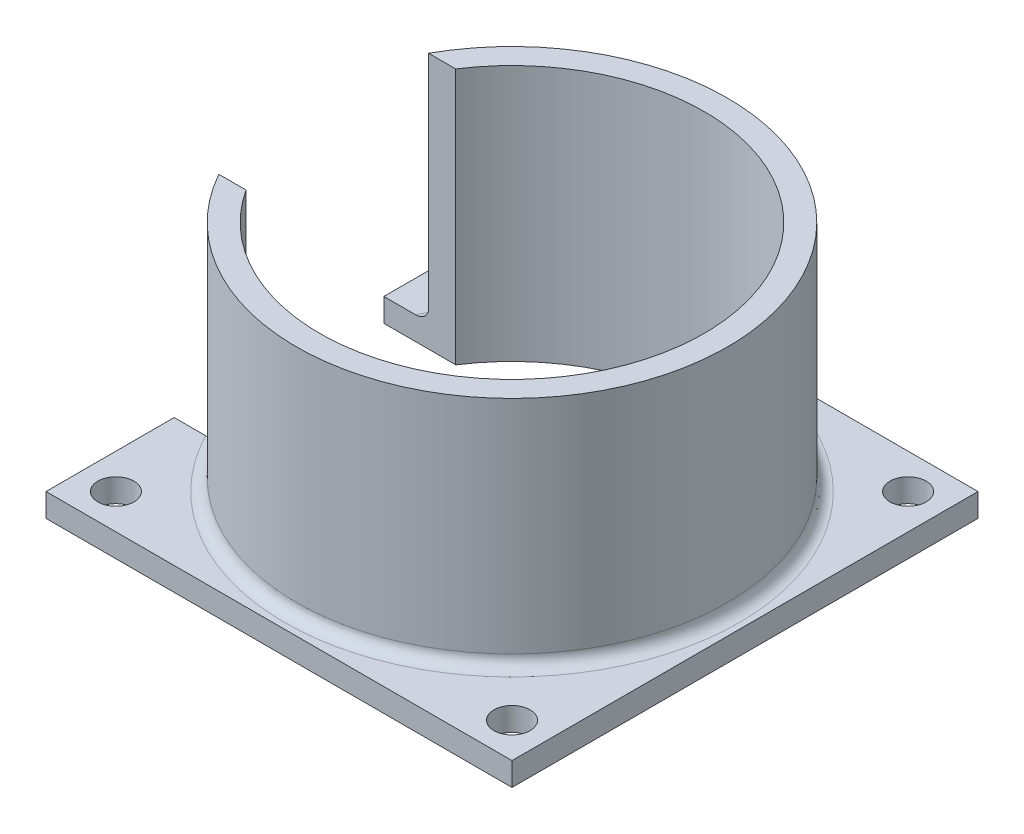
ISO-10303-21;
HEADER;
FILE_DESCRIPTION(('STEP AP214'),'2;1');
FILE_NAME('part.step','',(''),(''),'','','');
FILE_SCHEMA(('AUTOMOTIVE_DESIGN { 1 0 10303 214 1 1 1 1 }'));
ENDSEC;
DATA;
#1=APPLICATION_CONTEXT('core data for automotive mechanical design processes');
#2=APPLICATION_PROTOCOL_DEFINITION('international standard','automotive_design',2000,#1);
#3=PRODUCT_CONTEXT('',#1,'mechanical');
#4=PRODUCT('Part','Part','',(#3));
#5=PRODUCT_RELATED_PRODUCT_CATEGORY('part','',(#4));
#6=PRODUCT_DEFINITION_FORMATION('','',#4);
#7=PRODUCT_DEFINITION_CONTEXT('part definition',#1,'design');
#8=PRODUCT_DEFINITION('design','',#6,#7);
#9=PRODUCT_DEFINITION_SHAPE('','',#8);
#10=(LENGTH_UNIT() NAMED_UNIT(*) SI_UNIT(.MILLI.,.METRE.));
#11=(NAMED_UNIT(*) PLANE_ANGLE_UNIT() SI_UNIT($,.RADIAN.));
#12=(NAMED_UNIT(*) SI_UNIT($,.STERADIAN.) SOLID_ANGLE_UNIT());
#13=UNCERTAINTY_MEASURE_WITH_UNIT(LENGTH_MEASURE(1.E-05),#10,'distance_accuracy_value','');
#14=(GEOMETRIC_REPRESENTATION_CONTEXT(3) GLOBAL_UNCERTAINTY_ASSIGNED_CONTEXT((#13)) GLOBAL_UNIT_ASSIGNED_CONTEXT((#10,
#11,#12)) REPRESENTATION_CONTEXT('',''));
#15=CARTESIAN_POINT('',(0.,0.,0.));
#16=DIRECTION('',(0.,0.,1.));
#17=DIRECTION('',(1.,0.,0.));
#18=AXIS2_PLACEMENT_3D('',#15,#16,#17);
#19=CARTESIAN_POINT('',(0.,3.,0.));
#20=DIRECTION('',(0.,-1.,0.));
#21=DIRECTION('',(0.,0.,-1.));
#22=AXIS2_PLACEMENT_3D('',#19,#20,#21);
#23=TOROIDAL_SURFACE('',#22,19.5,1.);
#24=CARTESIAN_POINT('',(-18.3101271413205,2.56924594410709,9.));
#25=CARTESIAN_POINT('',(-18.2829502959148,2.51815456407586,9.));
#26=CARTESIAN_POINT('',(-18.2510852016169,2.46947427224021,9.));
#27=CARTESIAN_POINT('',(-18.1794045357029,2.37827313475207,9.));
#28=CARTESIAN_POINT('',(-18.1395690857026,2.3357681574866,9.));
#29=CARTESIAN_POINT('',(-18.0537110394812,2.25804095469755,9.));
#30=CARTESIAN_POINT('',(-18.0077196192548,2.22278416600207,9.));
#31=CARTESIAN_POINT('',(-17.9108913865268,2.15981651268745,9.));
#32=CARTESIAN_POINT('',(-17.8600563796686,2.13210285080582,9.));
#33=CARTESIAN_POINT('',(-17.7504945110088,2.08247514066225,9.));
#34=CARTESIAN_POINT('',(-17.691462891365,2.06123457997038,9.));
#35=CARTESIAN_POINT('',(-17.5708436711323,2.02801347906853,9.));
#36=CARTESIAN_POINT('',(-17.5092547373869,2.01603783427812,9.));
#37=CARTESIAN_POINT('',(-17.3791676387603,2.00068518554398,9.));
#38=CARTESIAN_POINT('',(-17.3105613440025,1.99821557046956,9.));
#39=CARTESIAN_POINT('',(-17.1738261197022,2.00430987290342,9.));
#40=CARTESIAN_POINT('',(-17.1056973731782,2.01287781044907,9.));
#41=CARTESIAN_POINT('',(-16.9688479520684,2.04153015255391,9.));
#42=CARTESIAN_POINT('',(-16.9002256087017,2.06208942363964,9.));
#43=CARTESIAN_POINT('',(-16.7675804685551,2.11486740059921,9.));
#44=CARTESIAN_POINT('',(-16.7035578462879,2.14708654856738,9.));
#45=CARTESIAN_POINT('',(-16.5847774168978,2.22135371138029,9.));
#46=CARTESIAN_POINT('',(-16.529762007999,2.26298727808905,9.));
#47=CARTESIAN_POINT('',(-16.4286353277936,2.35597130473824,9.));
#48=CARTESIAN_POINT('',(-16.3825163960515,2.40731332894757,9.));
#49=CARTESIAN_POINT('',(-16.3063482595141,2.51207641427239,9.));
#50=CARTESIAN_POINT('',(-16.275069868373,2.56460160277944,9.));
#51=CARTESIAN_POINT('',(-16.2233157804133,2.67472510305569,9.));
#52=CARTESIAN_POINT('',(-16.202827696211,2.73231750853345,9.));
#53=CARTESIAN_POINT('',(-16.1758567882779,2.84280104535768,9.));
#54=CARTESIAN_POINT('',(-16.1679048444078,2.89533629166901,9.));
#55=CARTESIAN_POINT('',(-16.161633561531,3.00097172142033,9.));
#56=CARTESIAN_POINT('',(-16.163309858045,3.05407163800138,9.));
#57=CARTESIAN_POINT('',(-16.1757562951053,3.15556835776479,9.));
#58=CARTESIAN_POINT('',(-16.1859113776314,3.20404235632102,9.));
#59=CARTESIAN_POINT('',(-16.2140202495722,3.29866252108459,9.));
#60=CARTESIAN_POINT('',(-16.2319743513989,3.34480859395758,9.));
#61=CARTESIAN_POINT('',(-16.2754534825831,3.43482319417554,9.));
#62=CARTESIAN_POINT('',(-16.3011598429392,3.47860367450057,9.));
#63=CARTESIAN_POINT('',(-16.358952546358,3.5617151197667,9.));
#64=CARTESIAN_POINT('',(-16.3910409677095,3.60104462870625,9.));
#65=CARTESIAN_POINT('',(-16.4638490882095,3.67814062979872,9.));
#66=CARTESIAN_POINT('',(-16.5050985223968,3.71540595261643,9.));
#67=CARTESIAN_POINT('',(-16.5926728102617,3.78338472949006,9.));
#68=CARTESIAN_POINT('',(-16.6390000016887,3.81409514639278,9.));
#69=CARTESIAN_POINT('',(-16.7414185853863,3.87199550200819,9.));
#70=CARTESIAN_POINT('',(-16.7980116514962,3.89829867158957,9.));
#71=CARTESIAN_POINT('',(-16.9145263176786,3.94203598712313,9.));
#72=CARTESIAN_POINT('',(-16.974449499225,3.95946587853111,9.));
#73=CARTESIAN_POINT('',(-17.1024374423495,3.9866244598098,9.));
#74=CARTESIAN_POINT('',(-17.1707089875051,3.995385689178,9.));
#75=CARTESIAN_POINT('',(-17.3077875284243,4.0018193372848,9.));
#76=CARTESIAN_POINT('',(-17.3765947035932,3.99948786565502,9.));
#77=CARTESIAN_POINT('',(-17.5156693729033,3.9833364489566,9.));
#78=CARTESIAN_POINT('',(-17.5858848989612,3.96905988765668,9.));
#79=CARTESIAN_POINT('',(-17.722763940055,3.92843639290725,9.));
#80=CARTESIAN_POINT('',(-17.7894276571186,3.90209014680434,9.));
#81=CARTESIAN_POINT('',(-17.9142377958733,3.83887978745806,9.));
#82=CARTESIAN_POINT('',(-17.9726191092526,3.80248198161029,9.));
#83=CARTESIAN_POINT('',(-18.0815382912684,3.71937566632096,9.));
#84=CARTESIAN_POINT('',(-18.1320816602456,3.67267444365419,9.));
#85=CARTESIAN_POINT('',(-18.2182679434946,3.57529309211806,9.));
#86=CARTESIAN_POINT('',(-18.2548995184104,3.52548925632797,9.));
#87=CARTESIAN_POINT('',(-18.3180457432798,3.41983635583044,9.));
#88=CARTESIAN_POINT('',(-18.3445697949904,3.36399297134819,9.));
#89=CARTESIAN_POINT('',(-18.3837586730539,3.25455557772599,9.));
#90=CARTESIAN_POINT('',(-18.3976282660697,3.20139133627361,9.));
#91=CARTESIAN_POINT('',(-18.4155352699758,3.0934160146769,9.));
#92=CARTESIAN_POINT('',(-18.4195740503917,3.03860516499787,9.));
#93=CARTESIAN_POINT('',(-18.4176829450658,2.93280892011583,9.));
#94=CARTESIAN_POINT('',(-18.412394662629,2.8818102588372,9.));
#95=CARTESIAN_POINT('',(-18.3933130405838,2.78149186756729,9.));
#96=CARTESIAN_POINT('',(-18.3795336721596,2.73216951975746,9.));
#97=CARTESIAN_POINT('',(-18.3545148594317,2.66462051278946,9.));
#98=CARTESIAN_POINT('',(-18.3465312580528,2.6451333467363,9.));
#99=CARTESIAN_POINT('',(-18.3292808426516,2.60673979454384,9.));
#100=CARTESIAN_POINT('',(-18.3200142486158,2.58783330951652,9.));
#101=CARTESIAN_POINT('',(-18.3101271413205,2.56924594410709,9.));
#102=B_SPLINE_CURVE_WITH_KNOTS('',3,(#24,#25,#26,#27,#28,#29,#30,#31,#32,#33,#34,#35,#36,#37,
#38,#39,#40,#41,#42,#43,#44,#45,#46,#47,#48,#49,#50,#51,#52,#53,#54,#55,#56,#57,#58,#59,#60,#61,
#62,#63,#64,#65,#66,#67,#68,#69,#70,#71,#72,#73,#74,#75,#76,#77,#78,#79,#80,#81,#82,#83,#84,#85,
#86,#87,#88,#89,#90,#91,#92,#93,#94,#95,#96,#97,#98,#99,#100,#101),.UNSPECIFIED.,.T.,.F.,(4,2,2,
2,2,2,2,2,2,2,2,2,2,2,2,2,2,2,2,2,2,2,2,2,2,2,2,2,2,2,2,2,2,2,2,2,2,2,4),(0.,0.17352359468617,
0.34748548322867,0.520597536649415,0.693645306163215,0.881076005012454,1.06860567145481,
1.27364724354002,1.47876351586902,1.69261420031796,1.90647299395031,2.11230234834754,
2.31795367155654,2.5002860232071,2.68240859663684,2.84096661648071,2.99945276768078,
3.14735018657774,3.2952535304742,3.44692723184684,3.59865040616998,3.76474918920437,
3.93092476626036,4.11737643335802,4.30391741597918,4.50949547694687,4.7151456423854,
4.92903651061193,5.14291519965647,5.34818052192417,5.55330113930778,5.73773480335753,
5.92199649076824,6.08596198533876,6.2499046366502,6.40300510509096,6.55585433306614,
6.61899412103216,6.68212309620602),.UNSPECIFIED.);
#103=CARTESIAN_POINT('',(-17.2988438920062,2.,9.));
#104=VERTEX_POINT('',#103);
#105=CARTESIAN_POINT('',(-16.1632298752446,3.,9.));
#106=VERTEX_POINT('',#105);
#107=EDGE_CURVE('E67',#104,#106,#102,.T.);
#108=ORIENTED_EDGE('',*,*,#107,.F.);
#109=CARTESIAN_POINT('',(0.,2.,0.));
#110=DIRECTION('',(0.,-1.,0.));
#111=DIRECTION('',(0.,0.,-1.));
#112=AXIS2_PLACEMENT_3D('',#109,#110,#111);
#113=CIRCLE('',#112,19.5);
#114=CARTESIAN_POINT('',(-17.2988438920062,2.,-9.));
#115=VERTEX_POINT('',#114);
#116=EDGE_CURVE('E243',#115,#104,#113,.T.);
#117=ORIENTED_EDGE('',*,*,#116,.F.);
#118=CARTESIAN_POINT('',(-18.3101271413205,2.56924594410709,-9.));
#119=CARTESIAN_POINT('',(-18.2829502959148,2.51815456407586,-9.));
#120=CARTESIAN_POINT('',(-18.2510852016169,2.4694742722402,-9.));
#121=CARTESIAN_POINT('',(-18.1794045357029,2.37827313475206,-9.));
#122=CARTESIAN_POINT('',(-18.1395690857026,2.3357681574866,-9.));
#123=CARTESIAN_POINT('',(-18.0537110394812,2.25804095469755,-9.));
#124=CARTESIAN_POINT('',(-18.0077196192548,2.22278416600207,-9.));
#125=CARTESIAN_POINT('',(-17.9108913865268,2.15981651268745,-9.));
#126=CARTESIAN_POINT('',(-17.8600563796686,2.13210285080582,-9.));
#127=CARTESIAN_POINT('',(-17.7504945110088,2.08247514066225,-9.));
#128=CARTESIAN_POINT('',(-17.691462891365,2.06123457997038,-9.));
#129=CARTESIAN_POINT('',(-17.5708436711323,2.02801347906853,-9.));
#130=CARTESIAN_POINT('',(-17.5092547373869,2.01603783427812,-9.));
#131=CARTESIAN_POINT('',(-17.3791676387603,2.00068518554398,-9.));
#132=CARTESIAN_POINT('',(-17.3105613440025,1.99821557046956,-9.));
#133=CARTESIAN_POINT('',(-17.1738261197022,2.00430987290342,-9.));
#134=CARTESIAN_POINT('',(-17.1056973731782,2.01287781044907,-9.));
#135=CARTESIAN_POINT('',(-16.9688479520684,2.04153015255391,-9.));
#136=CARTESIAN_POINT('',(-16.9002256087017,2.06208942363963,-9.));
#137=CARTESIAN_POINT('',(-16.7675804685551,2.11486740059921,-9.));
#138=CARTESIAN_POINT('',(-16.7035578462879,2.14708654856738,-9.));
#139=CARTESIAN_POINT('',(-16.5847774168978,2.22135371138029,-9.));
#140=CARTESIAN_POINT('',(-16.529762007999,2.26298727808905,-9.));
#141=CARTESIAN_POINT('',(-16.4286353277936,2.35597130473825,-9.));
#142=CARTESIAN_POINT('',(-16.3825163960515,2.40731332894758,-9.));
#143=CARTESIAN_POINT('',(-16.3063482595141,2.5120764142724,-9.));
#144=CARTESIAN_POINT('',(-16.275069868373,2.56460160277944,-9.));
#145=CARTESIAN_POINT('',(-16.2233157804133,2.67472510305569,-9.));
#146=CARTESIAN_POINT('',(-16.202827696211,2.73231750853345,-9.));
#147=CARTESIAN_POINT('',(-16.1758567882779,2.84280104535768,-9.));
#148=CARTESIAN_POINT('',(-16.1679048444078,2.89533629166901,-9.));
#149=CARTESIAN_POINT('',(-16.161633561531,3.00097172142033,-9.));
#150=CARTESIAN_POINT('',(-16.163309858045,3.05407163800138,-9.));
#151=CARTESIAN_POINT('',(-16.1757562951053,3.15556835776479,-9.));
#152=CARTESIAN_POINT('',(-16.1859113776314,3.20404235632102,-9.));
#153=CARTESIAN_POINT('',(-16.2140202495722,3.29866252108459,-9.));
#154=CARTESIAN_POINT('',(-16.2319743513989,3.34480859395758,-9.));
#155=CARTESIAN_POINT('',(-16.2754534825831,3.43482319417554,-9.));
#156=CARTESIAN_POINT('',(-16.3011598429392,3.47860367450057,-9.));
#157=CARTESIAN_POINT('',(-16.358952546358,3.5617151197667,-9.));
#158=CARTESIAN_POINT('',(-16.3910409677095,3.60104462870626,-9.));
#159=CARTESIAN_POINT('',(-16.4638490882095,3.67814062979873,-9.));
#160=CARTESIAN_POINT('',(-16.5050985223968,3.71540595261643,-9.));
#161=CARTESIAN_POINT('',(-16.5926728102617,3.78338472949006,-9.));
#162=CARTESIAN_POINT('',(-16.6390000016887,3.81409514639278,-9.));
#163=CARTESIAN_POINT('',(-16.7414185853863,3.87199550200819,-9.));
#164=CARTESIAN_POINT('',(-16.7980116514962,3.89829867158957,-9.));
#165=CARTESIAN_POINT('',(-16.9145263176786,3.94203598712313,-9.));
#166=CARTESIAN_POINT('',(-16.974449499225,3.95946587853111,-9.));
#167=CARTESIAN_POINT('',(-17.1024374423495,3.9866244598098,-9.));
#168=CARTESIAN_POINT('',(-17.1707089875051,3.995385689178,-9.));
#169=CARTESIAN_POINT('',(-17.3077875284243,4.00181933728481,-9.));
#170=CARTESIAN_POINT('',(-17.3765947035932,3.99948786565502,-9.));
#171=CARTESIAN_POINT('',(-17.5156693729033,3.9833364489566,-9.));
#172=CARTESIAN_POINT('',(-17.5858848989612,3.96905988765668,-9.));
#173=CARTESIAN_POINT('',(-17.722763940055,3.92843639290725,-9.));
#174=CARTESIAN_POINT('',(-17.7894276571186,3.90209014680434,-9.));
#175=CARTESIAN_POINT('',(-17.9142377958733,3.83887978745806,-9.));
#176=CARTESIAN_POINT('',(-17.9726191092526,3.80248198161029,-9.));
#177=CARTESIAN_POINT('',(-18.0815382912684,3.71937566632096,-9.));
#178=CARTESIAN_POINT('',(-18.1320816602456,3.67267444365419,-9.));
#179=CARTESIAN_POINT('',(-18.2182679434946,3.57529309211806,-9.));
#180=CARTESIAN_POINT('',(-18.2548995184104,3.52548925632797,-9.));
#181=CARTESIAN_POINT('',(-18.3180457432798,3.41983635583044,-9.));
#182=CARTESIAN_POINT('',(-18.3445697949904,3.36399297134819,-9.));
#183=CARTESIAN_POINT('',(-18.3837586730539,3.25455557772598,-9.));
#184=CARTESIAN_POINT('',(-18.3976282660697,3.20139133627361,-9.));
#185=CARTESIAN_POINT('',(-18.4155352699758,3.0934160146769,-9.));
#186=CARTESIAN_POINT('',(-18.4195740503917,3.03860516499787,-9.));
#187=CARTESIAN_POINT('',(-18.4176829450658,2.93280892011583,-9.));
#188=CARTESIAN_POINT('',(-18.412394662629,2.8818102588372,-9.));
#189=CARTESIAN_POINT('',(-18.3933130405838,2.78149186756729,-9.));
#190=CARTESIAN_POINT('',(-18.3795336721596,2.73216951975746,-9.));
#191=CARTESIAN_POINT('',(-18.3545148594317,2.66462051278946,-9.));
#192=CARTESIAN_POINT('',(-18.3465312580528,2.6451333467363,-9.));
#193=CARTESIAN_POINT('',(-18.3292808426516,2.60673979454384,-9.));
#194=CARTESIAN_POINT('',(-18.3200142486158,2.58783330951652,-9.));
#195=CARTESIAN_POINT('',(-18.3101271413205,2.56924594410709,-9.));
#196=B_SPLINE_CURVE_WITH_KNOTS('',3,(#118,#119,#120,#121,#122,#123,#124,#125,#126,#127,#128,
#129,#130,#131,#132,#133,#134,#135,#136,#137,#138,#139,#140,#141,#142,#143,#144,#145,#146,#147,
#148,#149,#150,#151,#152,#153,#154,#155,#156,#157,#158,#159,#160,#161,#162,#163,#164,#165,#166,
#167,#168,#169,#170,#171,#172,#173,#174,#175,#176,#177,#178,#179,#180,#181,#182,#183,#184,#185,
#186,#187,#188,#189,#190,#191,#192,#193,#194,#195),.UNSPECIFIED.,.T.,.F.,(4,2,2,2,2,2,2,2,2,2,2,
2,2,2,2,2,2,2,2,2,2,2,2,2,2,2,2,2,2,2,2,2,2,2,2,2,2,2,4),(0.,0.173523594686171,
0.347485483228672,0.520597536649417,0.693645306163218,0.881076005012459,1.06860567145482,
1.27364724354002,1.47876351586902,1.69261420031796,1.90647299395031,2.11230234834754,
2.31795367155654,2.5002860232071,2.68240859663684,2.84096661648072,2.99945276768078,
3.14735018657774,3.2952535304742,3.44692723184685,3.59865040616998,3.76474918920438,
3.93092476626036,4.11737643335802,4.30391741597918,4.50949547694687,4.7151456423854,
4.92903651061193,5.14291519965647,5.34818052192417,5.55330113930778,5.73773480335753,
5.92199649076824,6.08596198533877,6.24990463665021,6.40300510509096,6.55585433306614,
6.61899412103216,6.68212309620602),.UNSPECIFIED.);
#197=CARTESIAN_POINT('',(-16.1632298752446,3.,-9.));
#198=VERTEX_POINT('',#197);
#199=EDGE_CURVE('E251',#115,#198,#196,.T.);
#200=ORIENTED_EDGE('',*,*,#199,.T.);
#201=CARTESIAN_POINT('',(0.,3.,0.));
#202=DIRECTION('',(0.,-1.,0.));
#203=DIRECTION('',(0.,0.,-1.));
#204=AXIS2_PLACEMENT_3D('',#201,#202,#203);
#205=CIRCLE('',#204,18.5);
#206=EDGE_CURVE('E239',#106,#198,#205,.F.);
#207=ORIENTED_EDGE('',*,*,#206,.F.);
#208=EDGE_LOOP('',(#108,#117,#200,#207));
#209=FACE_BOUND('',#208,.T.);
#210=ADVANCED_FACE('F44',(#209),#23,.F.);
#211=CARTESIAN_POINT('',(0.,2.,0.));
#212=DIRECTION('',(0.,-1.,0.));
#213=DIRECTION('',(0.,0.,-1.));
#214=AXIS2_PLACEMENT_3D('',#211,#212,#213);
#215=PLANE('',#214);
#216=CARTESIAN_POINT('',(-17.0000000000002,2.,16.9999999999998));
#217=DIRECTION('',(0.,1.,0.));
#218=DIRECTION('',(0.,0.,1.));
#219=AXIS2_PLACEMENT_3D('',#216,#217,#218);
#220=CIRCLE('',#219,1.55);
#221=CARTESIAN_POINT('',(-17.0000000000002,2.,18.5499999999998));
#222=VERTEX_POINT('',#221);
#223=EDGE_CURVE('E164',#222,#222,#220,.T.);
#224=ORIENTED_EDGE('',*,*,#223,.F.);
#225=EDGE_LOOP('',(#224));
#226=FACE_BOUND('',#225,.T.);
#227=CARTESIAN_POINT('',(16.9999999999999,2.,17.0000000000001));
#228=DIRECTION('',(0.,1.,0.));
#229=DIRECTION('',(0.,0.,1.));
#230=AXIS2_PLACEMENT_3D('',#227,#228,#229);
#231=CIRCLE('',#230,1.55);
#232=CARTESIAN_POINT('',(16.9999999999999,2.,18.5500000000001));
#233=VERTEX_POINT('',#232);
#234=EDGE_CURVE('E172',#233,#233,#231,.T.);
#235=ORIENTED_EDGE('',*,*,#234,.F.);
#236=EDGE_LOOP('',(#235));
#237=FACE_BOUND('',#236,.T.);
#238=CARTESIAN_POINT('',(17.0000000000001,2.,-16.9999999999999));
#239=DIRECTION('',(0.,1.,0.));
#240=DIRECTION('',(0.,0.,1.));
#241=AXIS2_PLACEMENT_3D('',#238,#239,#240);
#242=CIRCLE('',#241,1.55);
#243=CARTESIAN_POINT('',(17.0000000000001,2.,-15.4499999999999));
#244=VERTEX_POINT('',#243);
#245=EDGE_CURVE('E180',#244,#244,#242,.T.);
#246=ORIENTED_EDGE('',*,*,#245,.F.);
#247=EDGE_LOOP('',(#246));
#248=FACE_BOUND('',#247,.T.);
#249=CARTESIAN_POINT('',(-17.,2.,-17.));
#250=DIRECTION('',(0.,1.,0.));
#251=DIRECTION('',(0.,0.,1.));
#252=AXIS2_PLACEMENT_3D('',#249,#250,#251);
#253=CIRCLE('',#252,1.55);
#254=CARTESIAN_POINT('',(-17.,2.,-15.45));
#255=VERTEX_POINT('',#254);
#256=EDGE_CURVE('E188',#255,#255,#253,.T.);
#257=ORIENTED_EDGE('',*,*,#256,.F.);
#258=EDGE_LOOP('',(#257));
#259=FACE_BOUND('',#258,.T.);
#260=DIRECTION('',(1.,0.,0.));
#261=VECTOR('',#260,1.);
#262=CARTESIAN_POINT('',(0.,2.,9.));
#263=LINE('',#262,#261);
#264=CARTESIAN_POINT('',(-20.,2.,9.));
#265=VERTEX_POINT('',#264);
#266=EDGE_CURVE('E152',#265,#104,#263,.T.);
#267=ORIENTED_EDGE('',*,*,#266,.F.);
#268=DIRECTION('',(0.,0.,1.));
#269=VECTOR('',#268,1.);
#270=CARTESIAN_POINT('',(-20.,2.,20.));
#271=LINE('',#270,#269);
#272=CARTESIAN_POINT('',(-20.,2.,20.));
#273=VERTEX_POINT('',#272);
#274=EDGE_CURVE('E201',#265,#273,#271,.T.);
#275=ORIENTED_EDGE('',*,*,#274,.T.);
#276=DIRECTION('',(1.,0.,0.));
#277=VECTOR('',#276,1.);
#278=CARTESIAN_POINT('',(-20.,2.,20.));
#279=LINE('',#278,#277);
#280=CARTESIAN_POINT('',(20.,2.,20.));
#281=VERTEX_POINT('',#280);
#282=EDGE_CURVE('E200',#273,#281,#279,.T.);
#283=ORIENTED_EDGE('',*,*,#282,.T.);
#284=DIRECTION('',(0.,0.,-1.));
#285=VECTOR('',#284,1.);
#286=CARTESIAN_POINT('',(20.,2.,20.));
#287=LINE('',#286,#285);
#288=CARTESIAN_POINT('',(20.,2.,-20.));
#289=VERTEX_POINT('',#288);
#290=EDGE_CURVE('E204',#281,#289,#287,.T.);
#291=ORIENTED_EDGE('',*,*,#290,.T.);
#292=DIRECTION('',(-1.,0.,0.));
#293=VECTOR('',#292,1.);
#294=CARTESIAN_POINT('',(-20.,2.,-20.));
#295=LINE('',#294,#293);
#296=CARTESIAN_POINT('',(-20.,2.,-20.));
#297=VERTEX_POINT('',#296);
#298=EDGE_CURVE('E207',#289,#297,#295,.T.);
#299=ORIENTED_EDGE('',*,*,#298,.T.);
#300=CARTESIAN_POINT('',(-20.,2.,-9.));
#301=VERTEX_POINT('',#300);
#302=EDGE_CURVE('E196',#297,#301,#271,.T.);
#303=ORIENTED_EDGE('',*,*,#302,.T.);
#304=DIRECTION('',(1.,0.,0.));
#305=VECTOR('',#304,1.);
#306=CARTESIAN_POINT('',(0.,2.,-9.));
#307=LINE('',#306,#305);
#308=EDGE_CURVE('E256',#301,#115,#307,.T.);
#309=ORIENTED_EDGE('',*,*,#308,.T.);
#310=ORIENTED_EDGE('',*,*,#116,.T.);
#311=EDGE_LOOP('',(#267,#275,#283,#291,#299,#303,#309,#310));
#312=FACE_BOUND('',#311,.T.);
#313=ADVANCED_FACE('F304',(#226,#237,#248,#259,#312),#215,.F.);
#314=CARTESIAN_POINT('',(0.,0.,0.));
#315=DIRECTION('',(0.,-1.,0.));
#316=DIRECTION('',(0.,0.,-1.));
#317=AXIS2_PLACEMENT_3D('',#314,#315,#316);
#318=PLANE('',#317);
#319=CARTESIAN_POINT('',(-17.0000000000002,0.,16.9999999999998));
#320=DIRECTION('',(0.,1.,0.));
#321=DIRECTION('',(0.,0.,1.));
#322=AXIS2_PLACEMENT_3D('',#319,#320,#321);
#323=CIRCLE('',#322,1.55);
#324=CARTESIAN_POINT('',(-17.0000000000002,0.,18.5499999999998));
#325=VERTEX_POINT('',#324);
#326=EDGE_CURVE('E163',#325,#325,#323,.T.);
#327=ORIENTED_EDGE('',*,*,#326,.T.);
#328=EDGE_LOOP('',(#327));
#329=FACE_BOUND('',#328,.T.);
#330=CARTESIAN_POINT('',(17.0000000000001,0.,-16.9999999999999));
#331=DIRECTION('',(0.,1.,0.));
#332=DIRECTION('',(0.,0.,1.));
#333=AXIS2_PLACEMENT_3D('',#330,#331,#332);
#334=CIRCLE('',#333,1.55);
#335=CARTESIAN_POINT('',(17.0000000000001,0.,-15.4499999999999));
#336=VERTEX_POINT('',#335);
#337=EDGE_CURVE('E176',#336,#336,#334,.T.);
#338=ORIENTED_EDGE('',*,*,#337,.T.);
#339=EDGE_LOOP('',(#338));
#340=FACE_BOUND('',#339,.T.);
#341=CARTESIAN_POINT('',(-17.,0.,-17.));
#342=DIRECTION('',(0.,1.,0.));
#343=DIRECTION('',(0.,0.,1.));
#344=AXIS2_PLACEMENT_3D('',#341,#342,#343);
#345=CIRCLE('',#344,1.55);
#346=CARTESIAN_POINT('',(-17.,0.,-15.45));
#347=VERTEX_POINT('',#346);
#348=EDGE_CURVE('E184',#347,#347,#345,.T.);
#349=ORIENTED_EDGE('',*,*,#348,.T.);
#350=EDGE_LOOP('',(#349));
#351=FACE_BOUND('',#350,.T.);
#352=CARTESIAN_POINT('',(16.9999999999999,0.,17.0000000000001));
#353=DIRECTION('',(0.,1.,0.));
#354=DIRECTION('',(0.,0.,1.));
#355=AXIS2_PLACEMENT_3D('',#352,#353,#354);
#356=CIRCLE('',#355,1.55);
#357=CARTESIAN_POINT('',(16.9999999999999,0.,18.5500000000001));
#358=VERTEX_POINT('',#357);
#359=EDGE_CURVE('E168',#358,#358,#356,.T.);
#360=ORIENTED_EDGE('',*,*,#359,.T.);
#361=EDGE_LOOP('',(#360));
#362=FACE_BOUND('',#361,.T.);
#363=DIRECTION('',(0.,0.,1.));
#364=VECTOR('',#363,1.);
#365=CARTESIAN_POINT('',(-20.,0.,20.));
#366=LINE('',#365,#364);
#367=CARTESIAN_POINT('',(-20.,0.,9.));
#368=VERTEX_POINT('',#367);
#369=CARTESIAN_POINT('',(-20.,0.,20.));
#370=VERTEX_POINT('',#369);
#371=EDGE_CURVE('E192',#368,#370,#366,.T.);
#372=ORIENTED_EDGE('',*,*,#371,.F.);
#373=DIRECTION('',(1.,0.,0.));
#374=VECTOR('',#373,1.);
#375=CARTESIAN_POINT('',(0.,0.,9.));
#376=LINE('',#375,#374);
#377=CARTESIAN_POINT('',(-13.8293166859393,0.,9.));
#378=VERTEX_POINT('',#377);
#379=EDGE_CURVE('E441',#368,#378,#376,.T.);
#380=ORIENTED_EDGE('',*,*,#379,.T.);
#381=CARTESIAN_POINT('',(0.,0.,0.));
#382=DIRECTION('',(0.,1.,0.));
#383=DIRECTION('',(0.,0.,1.));
#384=AXIS2_PLACEMENT_3D('',#381,#382,#383);
#385=CIRCLE('',#384,16.5);
#386=CARTESIAN_POINT('',(-13.8293166859393,0.,-9.));
#387=VERTEX_POINT('',#386);
#388=EDGE_CURVE('E156',#378,#387,#385,.T.);
#389=ORIENTED_EDGE('',*,*,#388,.T.);
#390=DIRECTION('',(1.,0.,0.));
#391=VECTOR('',#390,1.);
#392=CARTESIAN_POINT('',(0.,0.,-9.));
#393=LINE('',#392,#391);
#394=CARTESIAN_POINT('',(-20.,0.,-9.));
#395=VERTEX_POINT('',#394);
#396=EDGE_CURVE('E128',#395,#387,#393,.T.);
#397=ORIENTED_EDGE('',*,*,#396,.F.);
#398=CARTESIAN_POINT('',(-20.,0.,-20.));
#399=VERTEX_POINT('',#398);
#400=EDGE_CURVE('E211',#399,#395,#366,.T.);
#401=ORIENTED_EDGE('',*,*,#400,.F.);
#402=DIRECTION('',(-1.,0.,0.));
#403=VECTOR('',#402,1.);
#404=CARTESIAN_POINT('',(-20.,0.,-20.));
#405=LINE('',#404,#403);
#406=CARTESIAN_POINT('',(20.,0.,-20.));
#407=VERTEX_POINT('',#406);
#408=EDGE_CURVE('E221',#407,#399,#405,.T.);
#409=ORIENTED_EDGE('',*,*,#408,.F.);
#410=DIRECTION('',(0.,0.,-1.));
#411=VECTOR('',#410,1.);
#412=CARTESIAN_POINT('',(20.,0.,20.));
#413=LINE('',#412,#411);
#414=CARTESIAN_POINT('',(20.,0.,20.));
#415=VERTEX_POINT('',#414);
#416=EDGE_CURVE('E218',#415,#407,#413,.T.);
#417=ORIENTED_EDGE('',*,*,#416,.F.);
#418=DIRECTION('',(1.,0.,0.));
#419=VECTOR('',#418,1.);
#420=CARTESIAN_POINT('',(-20.,0.,20.));
#421=LINE('',#420,#419);
#422=EDGE_CURVE('E215',#370,#415,#421,.T.);
#423=ORIENTED_EDGE('',*,*,#422,.F.);
#424=EDGE_LOOP('',(#372,#380,#389,#397,#401,#409,#417,#423));
#425=FACE_BOUND('',#424,.T.);
#426=ADVANCED_FACE('F307',(#329,#340,#351,#362,#425),#318,.T.);
#427=CARTESIAN_POINT('',(-20.,2.,20.));
#428=DIRECTION('',(1.,0.,0.));
#429=DIRECTION('',(0.,0.,-1.));
#430=AXIS2_PLACEMENT_3D('',#427,#428,#429);
#431=PLANE('',#430);
#432=DIRECTION('',(0.,-1.,0.));
#433=VECTOR('',#432,1.);
#434=CARTESIAN_POINT('',(-20.,22.,9.));
#435=LINE('',#434,#433);
#436=EDGE_CURVE('E146',#265,#368,#435,.T.);
#437=ORIENTED_EDGE('',*,*,#436,.T.);
#438=ORIENTED_EDGE('',*,*,#371,.T.);
#439=DIRECTION('',(0.,-1.,0.));
#440=VECTOR('',#439,1.);
#441=CARTESIAN_POINT('',(-20.,2.,20.));
#442=LINE('',#441,#440);
#443=EDGE_CURVE('E235',#273,#370,#442,.T.);
#444=ORIENTED_EDGE('',*,*,#443,.F.);
#445=ORIENTED_EDGE('',*,*,#274,.F.);
#446=EDGE_LOOP('',(#437,#438,#444,#445));
#447=FACE_BOUND('',#446,.T.);
#448=ADVANCED_FACE('F287',(#447),#431,.F.);
#449=CARTESIAN_POINT('',(0.,2.,0.));
#450=DIRECTION('',(0.,-1.,0.));
#451=DIRECTION('',(0.,0.,-1.));
#452=AXIS2_PLACEMENT_3D('',#449,#450,#451);
#453=CYLINDRICAL_SURFACE('',#452,16.5);
#454=ORIENTED_EDGE('',*,*,#388,.F.);
#455=DIRECTION('',(0.,-1.,0.));
#456=VECTOR('',#455,1.);
#457=CARTESIAN_POINT('',(-13.8293166859393,22.,9.));
#458=LINE('',#457,#456);
#459=CARTESIAN_POINT('',(-13.8293166859393,22.,9.));
#460=VERTEX_POINT('',#459);
#461=EDGE_CURVE('E134',#460,#378,#458,.T.);
#462=ORIENTED_EDGE('',*,*,#461,.F.);
#463=CARTESIAN_POINT('',(0.,22.,0.));
#464=DIRECTION('',(0.,1.,0.));
#465=DIRECTION('',(0.,0.,1.));
#466=AXIS2_PLACEMENT_3D('',#463,#464,#465);
#467=CIRCLE('',#466,16.5);
#468=CARTESIAN_POINT('',(-13.8293166859393,22.,-9.));
#469=VERTEX_POINT('',#468);
#470=EDGE_CURVE('E142',#460,#469,#467,.T.);
#471=ORIENTED_EDGE('',*,*,#470,.T.);
#472=DIRECTION('',(0.,-1.,0.));
#473=VECTOR('',#472,1.);
#474=CARTESIAN_POINT('',(-13.8293166859393,22.,-9.));
#475=LINE('',#474,#473);
#476=EDGE_CURVE('E125',#469,#387,#475,.T.);
#477=ORIENTED_EDGE('',*,*,#476,.T.);
#478=EDGE_LOOP('',(#454,#462,#471,#477));
#479=FACE_BOUND('',#478,.T.);
#480=ADVANCED_FACE('F150',(#479),#453,.F.);
#481=CARTESIAN_POINT('',(0.,22.,0.));
#482=DIRECTION('',(0.,1.,0.));
#483=DIRECTION('',(0.,0.,1.));
#484=AXIS2_PLACEMENT_3D('',#481,#482,#483);
#485=PLANE('',#484);
#486=ORIENTED_EDGE('',*,*,#470,.F.);
#487=DIRECTION('',(1.,0.,0.));
#488=VECTOR('',#487,1.);
#489=CARTESIAN_POINT('',(0.,22.,9.));
#490=LINE('',#489,#488);
#491=CARTESIAN_POINT('',(-16.1632298752446,22.,9.));
#492=VERTEX_POINT('',#491);
#493=EDGE_CURVE('E147',#492,#460,#490,.T.);
#494=ORIENTED_EDGE('',*,*,#493,.F.);
#495=CARTESIAN_POINT('',(0.,22.,0.));
#496=DIRECTION('',(0.,1.,0.));
#497=DIRECTION('',(0.,0.,1.));
#498=AXIS2_PLACEMENT_3D('',#495,#496,#497);
#499=CIRCLE('',#498,18.5);
#500=CARTESIAN_POINT('',(-16.1632298752446,22.,-9.));
#501=VERTEX_POINT('',#500);
#502=EDGE_CURVE('E144',#492,#501,#499,.T.);
#503=ORIENTED_EDGE('',*,*,#502,.T.);
#504=DIRECTION('',(1.,0.,0.));
#505=VECTOR('',#504,1.);
#506=CARTESIAN_POINT('',(0.,22.,-9.));
#507=LINE('',#506,#505);
#508=EDGE_CURVE('E60',#501,#469,#507,.T.);
#509=ORIENTED_EDGE('',*,*,#508,.T.);
#510=EDGE_LOOP('',(#486,#494,#503,#509));
#511=FACE_BOUND('',#510,.T.);
#512=ADVANCED_FACE('F140',(#511),#485,.T.);
#513=CARTESIAN_POINT('',(0.,22.,0.));
#514=DIRECTION('',(0.,-1.,0.));
#515=DIRECTION('',(0.,0.,-1.));
#516=AXIS2_PLACEMENT_3D('',#513,#514,#515);
#517=CYLINDRICAL_SURFACE('',#516,18.5);
#518=DIRECTION('',(0.,-1.,0.));
#519=VECTOR('',#518,1.);
#520=CARTESIAN_POINT('',(-16.1632298752446,22.,9.));
#521=LINE('',#520,#519);
#522=EDGE_CURVE('E11',#106,#492,#521,.F.);
#523=ORIENTED_EDGE('',*,*,#522,.F.);
#524=ORIENTED_EDGE('',*,*,#206,.T.);
#525=DIRECTION('',(0.,-1.,0.));
#526=VECTOR('',#525,1.);
#527=CARTESIAN_POINT('',(-16.1632298752446,22.,-9.));
#528=LINE('',#527,#526);
#529=EDGE_CURVE('E53',#198,#501,#528,.F.);
#530=ORIENTED_EDGE('',*,*,#529,.T.);
#531=ORIENTED_EDGE('',*,*,#502,.F.);
#532=EDGE_LOOP('',(#523,#524,#530,#531));
#533=FACE_BOUND('',#532,.T.);
#534=ADVANCED_FACE('F248',(#533),#517,.T.);
#535=ORIENTED_EDGE('',*,*,#400,.T.);
#536=DIRECTION('',(0.,-1.,0.));
#537=VECTOR('',#536,1.);
#538=CARTESIAN_POINT('',(-20.,22.,-9.));
#539=LINE('',#538,#537);
#540=EDGE_CURVE('E135',#301,#395,#539,.T.);
#541=ORIENTED_EDGE('',*,*,#540,.F.);
#542=ORIENTED_EDGE('',*,*,#302,.F.);
#543=DIRECTION('',(0.,-1.,0.));
#544=VECTOR('',#543,1.);
#545=CARTESIAN_POINT('',(-20.,2.,-20.));
#546=LINE('',#545,#544);
#547=EDGE_CURVE('E210',#297,#399,#546,.T.);
#548=ORIENTED_EDGE('',*,*,#547,.T.);
#549=EDGE_LOOP('',(#535,#541,#542,#548));
#550=FACE_BOUND('',#549,.T.);
#551=ADVANCED_FACE('F284',(#550),#431,.F.);
#552=CARTESIAN_POINT('',(-20.,2.,20.));
#553=DIRECTION('',(0.,0.,-1.));
#554=DIRECTION('',(-1.,0.,0.));
#555=AXIS2_PLACEMENT_3D('',#552,#553,#554);
#556=PLANE('',#555);
#557=ORIENTED_EDGE('',*,*,#422,.T.);
#558=DIRECTION('',(0.,-1.,0.));
#559=VECTOR('',#558,1.);
#560=CARTESIAN_POINT('',(20.,2.,20.));
#561=LINE('',#560,#559);
#562=EDGE_CURVE('E231',#281,#415,#561,.T.);
#563=ORIENTED_EDGE('',*,*,#562,.F.);
#564=ORIENTED_EDGE('',*,*,#282,.F.);
#565=ORIENTED_EDGE('',*,*,#443,.T.);
#566=EDGE_LOOP('',(#557,#563,#564,#565));
#567=FACE_BOUND('',#566,.T.);
#568=ADVANCED_FACE('F318',(#567),#556,.F.);
#569=CARTESIAN_POINT('',(20.,2.,20.));
#570=DIRECTION('',(-1.,0.,0.));
#571=DIRECTION('',(0.,0.,1.));
#572=AXIS2_PLACEMENT_3D('',#569,#570,#571);
#573=PLANE('',#572);
#574=ORIENTED_EDGE('',*,*,#416,.T.);
#575=DIRECTION('',(0.,-1.,0.));
#576=VECTOR('',#575,1.);
#577=CARTESIAN_POINT('',(20.,2.,-20.));
#578=LINE('',#577,#576);
#579=EDGE_CURVE('E227',#289,#407,#578,.T.);
#580=ORIENTED_EDGE('',*,*,#579,.F.);
#581=ORIENTED_EDGE('',*,*,#290,.F.);
#582=ORIENTED_EDGE('',*,*,#562,.T.);
#583=EDGE_LOOP('',(#574,#580,#581,#582));
#584=FACE_BOUND('',#583,.T.);
#585=ADVANCED_FACE('F314',(#584),#573,.F.);
#586=CARTESIAN_POINT('',(-20.,2.,-20.));
#587=DIRECTION('',(0.,0.,1.));
#588=DIRECTION('',(1.,0.,0.));
#589=AXIS2_PLACEMENT_3D('',#586,#587,#588);
#590=PLANE('',#589);
#591=ORIENTED_EDGE('',*,*,#408,.T.);
#592=ORIENTED_EDGE('',*,*,#547,.F.);
#593=ORIENTED_EDGE('',*,*,#298,.F.);
#594=ORIENTED_EDGE('',*,*,#579,.T.);
#595=EDGE_LOOP('',(#591,#592,#593,#594));
#596=FACE_BOUND('',#595,.T.);
#597=ADVANCED_FACE('F302',(#596),#590,.F.);
#598=CARTESIAN_POINT('',(-17.,2.,-17.));
#599=DIRECTION('',(0.,-1.,0.));
#600=DIRECTION('',(0.,0.,-1.));
#601=AXIS2_PLACEMENT_3D('',#598,#599,#600);
#602=CYLINDRICAL_SURFACE('',#601,1.55);
#603=ORIENTED_EDGE('',*,*,#256,.T.);
#604=EDGE_LOOP('',(#603));
#605=FACE_BOUND('',#604,.T.);
#606=ORIENTED_EDGE('',*,*,#348,.F.);
#607=EDGE_LOOP('',(#606));
#608=FACE_BOUND('',#607,.T.);
#609=ADVANCED_FACE('F298',(#605,#608),#602,.F.);
#610=CARTESIAN_POINT('',(17.0000000000001,2.,-16.9999999999999));
#611=DIRECTION('',(0.,-1.,0.));
#612=DIRECTION('',(0.,0.,-1.));
#613=AXIS2_PLACEMENT_3D('',#610,#611,#612);
#614=CYLINDRICAL_SURFACE('',#613,1.55);
#615=ORIENTED_EDGE('',*,*,#245,.T.);
#616=EDGE_LOOP('',(#615));
#617=FACE_BOUND('',#616,.T.);
#618=ORIENTED_EDGE('',*,*,#337,.F.);
#619=EDGE_LOOP('',(#618));
#620=FACE_BOUND('',#619,.T.);
#621=ADVANCED_FACE('F294',(#617,#620),#614,.F.);
#622=CARTESIAN_POINT('',(16.9999999999999,2.,17.0000000000001));
#623=DIRECTION('',(0.,-1.,0.));
#624=DIRECTION('',(0.,0.,-1.));
#625=AXIS2_PLACEMENT_3D('',#622,#623,#624);
#626=CYLINDRICAL_SURFACE('',#625,1.55);
#627=ORIENTED_EDGE('',*,*,#234,.T.);
#628=EDGE_LOOP('',(#627));
#629=FACE_BOUND('',#628,.T.);
#630=ORIENTED_EDGE('',*,*,#359,.F.);
#631=EDGE_LOOP('',(#630));
#632=FACE_BOUND('',#631,.T.);
#633=ADVANCED_FACE('F290',(#629,#632),#626,.F.);
#634=CARTESIAN_POINT('',(-17.0000000000002,2.,16.9999999999998));
#635=DIRECTION('',(0.,-1.,0.));
#636=DIRECTION('',(0.,0.,-1.));
#637=AXIS2_PLACEMENT_3D('',#634,#635,#636);
#638=CYLINDRICAL_SURFACE('',#637,1.55);
#639=ORIENTED_EDGE('',*,*,#223,.T.);
#640=EDGE_LOOP('',(#639));
#641=FACE_BOUND('',#640,.T.);
#642=ORIENTED_EDGE('',*,*,#326,.F.);
#643=EDGE_LOOP('',(#642));
#644=FACE_BOUND('',#643,.T.);
#645=ADVANCED_FACE('F272',(#641,#644),#638,.F.);
#646=CARTESIAN_POINT('',(0.,22.,-9.));
#647=DIRECTION('',(0.,0.,-1.));
#648=DIRECTION('',(-1.,0.,0.));
#649=AXIS2_PLACEMENT_3D('',#646,#647,#648);
#650=PLANE('',#649);
#651=ORIENTED_EDGE('',*,*,#540,.T.);
#652=ORIENTED_EDGE('',*,*,#396,.T.);
#653=ORIENTED_EDGE('',*,*,#476,.F.);
#654=ORIENTED_EDGE('',*,*,#508,.F.);
#655=ORIENTED_EDGE('',*,*,#529,.F.);
#656=ORIENTED_EDGE('',*,*,#199,.F.);
#657=ORIENTED_EDGE('',*,*,#308,.F.);
#658=EDGE_LOOP('',(#651,#652,#653,#654,#655,#656,#657));
#659=FACE_BOUND('',#658,.T.);
#660=ADVANCED_FACE('F126',(#659),#650,.F.);
#661=CARTESIAN_POINT('',(0.,22.,9.));
#662=DIRECTION('',(0.,0.,-1.));
#663=DIRECTION('',(-1.,0.,0.));
#664=AXIS2_PLACEMENT_3D('',#661,#662,#663);
#665=PLANE('',#664);
#666=ORIENTED_EDGE('',*,*,#266,.T.);
#667=ORIENTED_EDGE('',*,*,#107,.T.);
#668=ORIENTED_EDGE('',*,*,#522,.T.);
#669=ORIENTED_EDGE('',*,*,#493,.T.);
#670=ORIENTED_EDGE('',*,*,#461,.T.);
#671=ORIENTED_EDGE('',*,*,#379,.F.);
#672=ORIENTED_EDGE('',*,*,#436,.F.);
#673=EDGE_LOOP('',(#666,#667,#668,#669,#670,#671,#672));
#674=FACE_BOUND('',#673,.T.);
#675=ADVANCED_FACE('F271',(#674),#665,.T.);
#676=CLOSED_SHELL('',(#210,#313,#426,#448,#480,#512,#534,#551,#568,#585,#597,#609,#621,#633,
#645,#660,#675));
#677=MANIFOLD_SOLID_BREP('B2',#676);
#678=ADVANCED_BREP_SHAPE_REPRESENTATION('',(#18,#677),#14);
#679=SHAPE_DEFINITION_REPRESENTATION(#9,#678);
ENDSEC;
END-ISO-10303-21;
